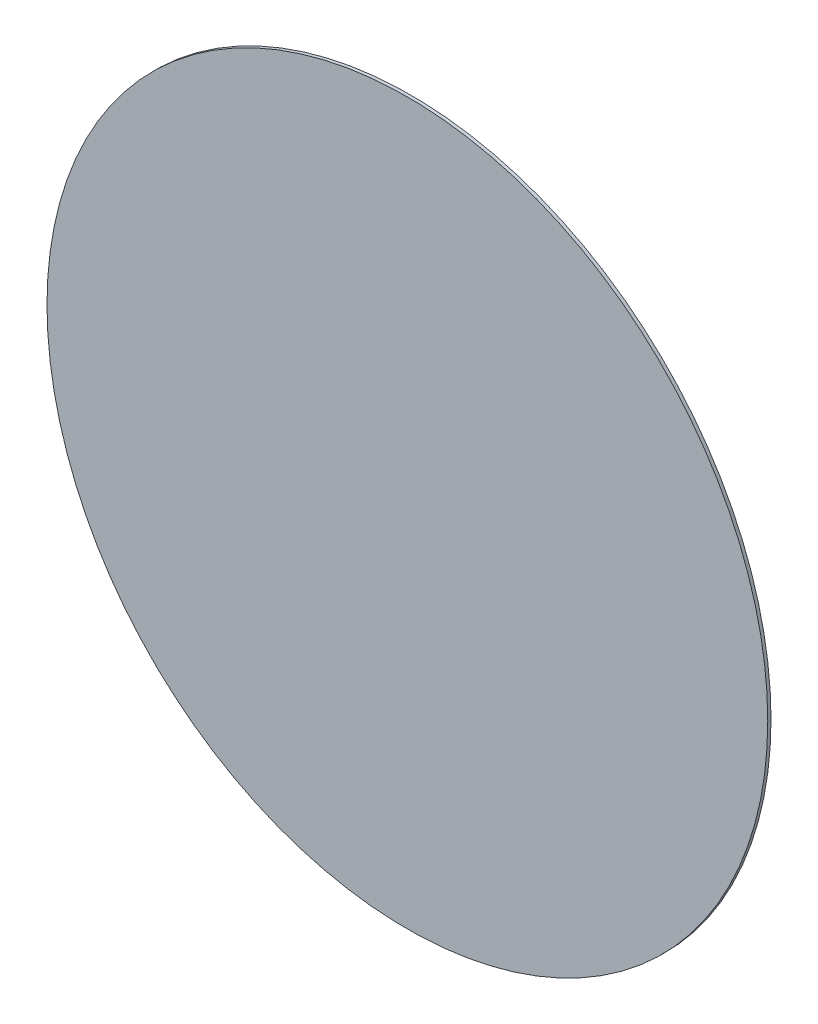
ISO-10303-21;
HEADER;
FILE_DESCRIPTION(('STEP AP214'),'2;1');
FILE_NAME('part.step','',(''),(''),'','','');
FILE_SCHEMA(('AUTOMOTIVE_DESIGN { 1 0 10303 214 1 1 1 1 }'));
ENDSEC;
DATA;
#1=APPLICATION_CONTEXT('core data for automotive mechanical design processes');
#2=APPLICATION_PROTOCOL_DEFINITION('international standard','automotive_design',2000,#1);
#3=PRODUCT_CONTEXT('',#1,'mechanical');
#4=PRODUCT('Part','Part','',(#3));
#5=PRODUCT_RELATED_PRODUCT_CATEGORY('part','',(#4));
#6=PRODUCT_DEFINITION_FORMATION('','',#4);
#7=PRODUCT_DEFINITION_CONTEXT('part definition',#1,'design');
#8=PRODUCT_DEFINITION('design','',#6,#7);
#9=PRODUCT_DEFINITION_SHAPE('','',#8);
#10=(LENGTH_UNIT() NAMED_UNIT(*) SI_UNIT(.MILLI.,.METRE.));
#11=(NAMED_UNIT(*) PLANE_ANGLE_UNIT() SI_UNIT($,.RADIAN.));
#12=(NAMED_UNIT(*) SI_UNIT($,.STERADIAN.) SOLID_ANGLE_UNIT());
#13=UNCERTAINTY_MEASURE_WITH_UNIT(LENGTH_MEASURE(1.E-05),#10,'distance_accuracy_value','');
#14=(GEOMETRIC_REPRESENTATION_CONTEXT(3) GLOBAL_UNCERTAINTY_ASSIGNED_CONTEXT((#13)) GLOBAL_UNIT_ASSIGNED_CONTEXT((#10,
#11,#12)) REPRESENTATION_CONTEXT('',''));
#15=CARTESIAN_POINT('',(0.,0.,0.));
#16=DIRECTION('',(0.,0.,1.));
#17=DIRECTION('',(1.,0.,0.));
#18=AXIS2_PLACEMENT_3D('',#15,#16,#17);
#19=CARTESIAN_POINT('',(0.,0.,0.86487));
#20=DIRECTION('',(0.,0.,1.));
#21=DIRECTION('',(-1.,0.,0.));
#22=AXIS2_PLACEMENT_3D('',#19,#20,#21);
#23=CYLINDRICAL_SURFACE('',#22,1.905);
#24=CARTESIAN_POINT('',(0.,0.,0.86487));
#25=DIRECTION('',(0.,0.,-1.));
#26=DIRECTION('',(-1.,0.,0.));
#27=AXIS2_PLACEMENT_3D('',#24,#25,#26);
#28=CIRCLE('',#27,1.905);
#29=CARTESIAN_POINT('',(-1.905,0.,0.86487));
#30=VERTEX_POINT('',#29);
#31=EDGE_CURVE('E11',#30,#30,#28,.T.);
#32=ORIENTED_EDGE('',*,*,#31,.F.);
#33=EDGE_LOOP('',(#32));
#34=FACE_BOUND('',#33,.T.);
#35=CARTESIAN_POINT('',(0.,0.,0.882015));
#36=DIRECTION('',(0.,0.,-1.));
#37=DIRECTION('',(-1.,0.,0.));
#38=AXIS2_PLACEMENT_3D('',#35,#36,#37);
#39=CIRCLE('',#38,1.905);
#40=CARTESIAN_POINT('',(-1.905,0.,0.882015));
#41=VERTEX_POINT('',#40);
#42=EDGE_CURVE('E20',#41,#41,#39,.T.);
#43=ORIENTED_EDGE('',*,*,#42,.T.);
#44=EDGE_LOOP('',(#43));
#45=FACE_BOUND('',#44,.T.);
#46=ADVANCED_FACE('F16',(#34,#45),#23,.T.);
#47=CARTESIAN_POINT('',(0.,0.,0.86487));
#48=DIRECTION('',(0.,0.,-1.));
#49=DIRECTION('',(0.,-1.,0.));
#50=AXIS2_PLACEMENT_3D('',#47,#48,#49);
#51=PLANE('',#50);
#52=ORIENTED_EDGE('',*,*,#31,.T.);
#53=EDGE_LOOP('',(#52));
#54=FACE_BOUND('',#53,.T.);
#55=ADVANCED_FACE('F50',(#54),#51,.T.);
#56=CARTESIAN_POINT('',(0.,0.,0.882015));
#57=DIRECTION('',(0.,0.,1.));
#58=DIRECTION('',(1.,0.,0.));
#59=AXIS2_PLACEMENT_3D('',#56,#57,#58);
#60=PLANE('',#59);
#61=ORIENTED_EDGE('',*,*,#42,.F.);
#62=EDGE_LOOP('',(#61));
#63=FACE_BOUND('',#62,.T.);
#64=ADVANCED_FACE('F18',(#63),#60,.T.);
#65=CLOSED_SHELL('',(#46,#55,#64));
#66=MANIFOLD_SOLID_BREP('B1',#65);
#67=ADVANCED_BREP_SHAPE_REPRESENTATION('',(#18,#66),#14);
#68=SHAPE_DEFINITION_REPRESENTATION(#9,#67);
ENDSEC;
END-ISO-10303-21;
